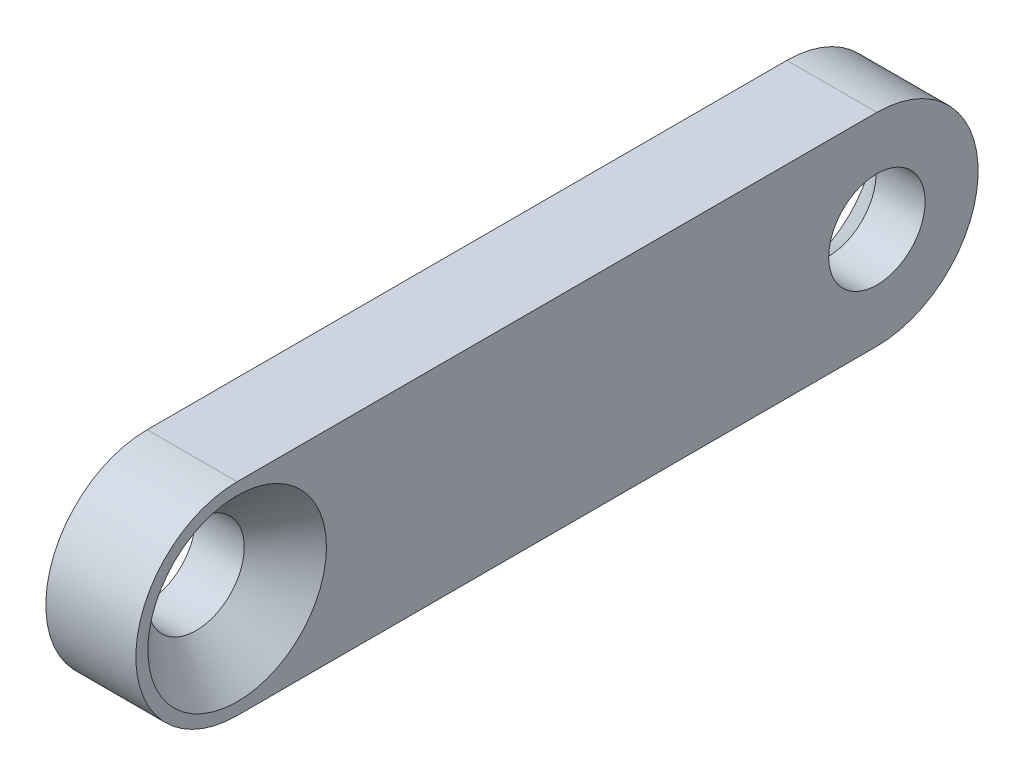
ISO-10303-21;
HEADER;
FILE_DESCRIPTION(('STEP AP214'),'2;1');
FILE_NAME('part.step','',(''),(''),'','','');
FILE_SCHEMA(('AUTOMOTIVE_DESIGN { 1 0 10303 214 1 1 1 1 }'));
ENDSEC;
DATA;
#1=APPLICATION_CONTEXT('core data for automotive mechanical design processes');
#2=APPLICATION_PROTOCOL_DEFINITION('international standard','automotive_design',2000,#1);
#3=PRODUCT_CONTEXT('',#1,'mechanical');
#4=PRODUCT('Part','Part','',(#3));
#5=PRODUCT_RELATED_PRODUCT_CATEGORY('part','',(#4));
#6=PRODUCT_DEFINITION_FORMATION('','',#4);
#7=PRODUCT_DEFINITION_CONTEXT('part definition',#1,'design');
#8=PRODUCT_DEFINITION('design','',#6,#7);
#9=PRODUCT_DEFINITION_SHAPE('','',#8);
#10=(LENGTH_UNIT() NAMED_UNIT(*) SI_UNIT(.MILLI.,.METRE.));
#11=(NAMED_UNIT(*) PLANE_ANGLE_UNIT() SI_UNIT($,.RADIAN.));
#12=(NAMED_UNIT(*) SI_UNIT($,.STERADIAN.) SOLID_ANGLE_UNIT());
#13=UNCERTAINTY_MEASURE_WITH_UNIT(LENGTH_MEASURE(1.E-05),#10,'distance_accuracy_value','');
#14=(GEOMETRIC_REPRESENTATION_CONTEXT(3) GLOBAL_UNCERTAINTY_ASSIGNED_CONTEXT((#13)) GLOBAL_UNIT_ASSIGNED_CONTEXT((#10,
#11,#12)) REPRESENTATION_CONTEXT('',''));
#15=CARTESIAN_POINT('',(0.,0.,0.));
#16=DIRECTION('',(0.,0.,1.));
#17=DIRECTION('',(1.,0.,0.));
#18=AXIS2_PLACEMENT_3D('',#15,#16,#17);
#19=CARTESIAN_POINT('',(3.175,0.,11.281730167));
#20=DIRECTION('',(-1.,0.,0.));
#21=DIRECTION('',(0.,0.,1.));
#22=AXIS2_PLACEMENT_3D('',#19,#20,#21);
#23=CYLINDRICAL_SURFACE('',#22,3.571875);
#24=CARTESIAN_POINT('',(0.,0.,11.281730167));
#25=DIRECTION('',(1.,0.,0.));
#26=DIRECTION('',(0.,0.,-1.));
#27=AXIS2_PLACEMENT_3D('',#24,#25,#26);
#28=CIRCLE('',#27,3.571875);
#29=CARTESIAN_POINT('',(0.,3.571875,11.281730167));
#30=VERTEX_POINT('',#29);
#31=CARTESIAN_POINT('',(0.,-3.571875,11.281730167));
#32=VERTEX_POINT('',#31);
#33=EDGE_CURVE('E101',#30,#32,#28,.T.);
#34=ORIENTED_EDGE('',*,*,#33,.T.);
#35=DIRECTION('',(-1.,0.,0.));
#36=VECTOR('',#35,1.);
#37=CARTESIAN_POINT('',(3.175,-3.571875,11.281730167));
#38=LINE('',#37,#36);
#39=CARTESIAN_POINT('',(3.175,-3.571875,11.281730167));
#40=VERTEX_POINT('',#39);
#41=EDGE_CURVE('E11',#40,#32,#38,.T.);
#42=ORIENTED_EDGE('',*,*,#41,.F.);
#43=CARTESIAN_POINT('',(3.175,0.,11.281730167));
#44=DIRECTION('',(1.,0.,0.));
#45=DIRECTION('',(0.,0.,-1.));
#46=AXIS2_PLACEMENT_3D('',#43,#44,#45);
#47=CIRCLE('',#46,3.571875);
#48=CARTESIAN_POINT('',(3.175,3.571875,11.281730167));
#49=VERTEX_POINT('',#48);
#50=EDGE_CURVE('E88',#49,#40,#47,.T.);
#51=ORIENTED_EDGE('',*,*,#50,.F.);
#52=DIRECTION('',(-1.,0.,0.));
#53=VECTOR('',#52,1.);
#54=CARTESIAN_POINT('',(3.175,3.571875,11.281730167));
#55=LINE('',#54,#53);
#56=EDGE_CURVE('E97',#49,#30,#55,.T.);
#57=ORIENTED_EDGE('',*,*,#56,.T.);
#58=EDGE_LOOP('',(#34,#42,#51,#57));
#59=FACE_BOUND('',#58,.T.);
#60=ADVANCED_FACE('F35',(#59),#23,.T.);
#61=CARTESIAN_POINT('',(3.175,-3.571875,11.281730167));
#62=DIRECTION('',(0.,1.,0.));
#63=DIRECTION('',(0.,0.,1.));
#64=AXIS2_PLACEMENT_3D('',#61,#62,#63);
#65=PLANE('',#64);
#66=DIRECTION('',(0.,0.,-1.));
#67=VECTOR('',#66,1.);
#68=CARTESIAN_POINT('',(0.,-3.571875,11.281730167));
#69=LINE('',#68,#67);
#70=CARTESIAN_POINT('',(0.,-3.571875,-11.281730167));
#71=VERTEX_POINT('',#70);
#72=EDGE_CURVE('E92',#32,#71,#69,.T.);
#73=ORIENTED_EDGE('',*,*,#72,.T.);
#74=DIRECTION('',(-1.,0.,0.));
#75=VECTOR('',#74,1.);
#76=CARTESIAN_POINT('',(3.175,-3.571875,-11.281730167));
#77=LINE('',#76,#75);
#78=CARTESIAN_POINT('',(3.175,-3.571875,-11.281730167));
#79=VERTEX_POINT('',#78);
#80=EDGE_CURVE('E44',#79,#71,#77,.T.);
#81=ORIENTED_EDGE('',*,*,#80,.F.);
#82=DIRECTION('',(0.,0.,-1.));
#83=VECTOR('',#82,1.);
#84=CARTESIAN_POINT('',(3.175,-3.571875,11.281730167));
#85=LINE('',#84,#83);
#86=EDGE_CURVE('E83',#40,#79,#85,.T.);
#87=ORIENTED_EDGE('',*,*,#86,.F.);
#88=ORIENTED_EDGE('',*,*,#41,.T.);
#89=EDGE_LOOP('',(#73,#81,#87,#88));
#90=FACE_BOUND('',#89,.T.);
#91=ADVANCED_FACE('F91',(#90),#65,.F.);
#92=CARTESIAN_POINT('',(3.175,0.,-11.281730167));
#93=DIRECTION('',(-1.,0.,0.));
#94=DIRECTION('',(0.,0.,1.));
#95=AXIS2_PLACEMENT_3D('',#92,#93,#94);
#96=CYLINDRICAL_SURFACE('',#95,3.571875);
#97=CARTESIAN_POINT('',(0.,0.,-11.281730167));
#98=DIRECTION('',(1.,0.,0.));
#99=DIRECTION('',(0.,0.,-1.));
#100=AXIS2_PLACEMENT_3D('',#97,#98,#99);
#101=CIRCLE('',#100,3.571875);
#102=CARTESIAN_POINT('',(0.,3.571875,-11.281730167));
#103=VERTEX_POINT('',#102);
#104=EDGE_CURVE('E70',#71,#103,#101,.T.);
#105=ORIENTED_EDGE('',*,*,#104,.T.);
#106=DIRECTION('',(-1.,0.,0.));
#107=VECTOR('',#106,1.);
#108=CARTESIAN_POINT('',(3.175,3.571875,-11.281730167));
#109=LINE('',#108,#107);
#110=CARTESIAN_POINT('',(3.175,3.571875,-11.281730167));
#111=VERTEX_POINT('',#110);
#112=EDGE_CURVE('E93',#111,#103,#109,.T.);
#113=ORIENTED_EDGE('',*,*,#112,.F.);
#114=CARTESIAN_POINT('',(3.175,0.,-11.281730167));
#115=DIRECTION('',(1.,0.,0.));
#116=DIRECTION('',(0.,0.,-1.));
#117=AXIS2_PLACEMENT_3D('',#114,#115,#116);
#118=CIRCLE('',#117,3.571875);
#119=EDGE_CURVE('E86',#79,#111,#118,.T.);
#120=ORIENTED_EDGE('',*,*,#119,.F.);
#121=ORIENTED_EDGE('',*,*,#80,.T.);
#122=EDGE_LOOP('',(#105,#113,#120,#121));
#123=FACE_BOUND('',#122,.T.);
#124=ADVANCED_FACE('F95',(#123),#96,.T.);
#125=CARTESIAN_POINT('',(3.175,3.571875,11.281730167));
#126=DIRECTION('',(0.,-1.,0.));
#127=DIRECTION('',(0.,0.,-1.));
#128=AXIS2_PLACEMENT_3D('',#125,#126,#127);
#129=PLANE('',#128);
#130=DIRECTION('',(0.,0.,1.));
#131=VECTOR('',#130,1.);
#132=CARTESIAN_POINT('',(0.,3.571875,11.281730167));
#133=LINE('',#132,#131);
#134=EDGE_CURVE('E76',#103,#30,#133,.T.);
#135=ORIENTED_EDGE('',*,*,#134,.T.);
#136=ORIENTED_EDGE('',*,*,#56,.F.);
#137=DIRECTION('',(0.,0.,1.));
#138=VECTOR('',#137,1.);
#139=CARTESIAN_POINT('',(3.175,3.571875,11.281730167));
#140=LINE('',#139,#138);
#141=EDGE_CURVE('E53',#111,#49,#140,.T.);
#142=ORIENTED_EDGE('',*,*,#141,.F.);
#143=ORIENTED_EDGE('',*,*,#112,.T.);
#144=EDGE_LOOP('',(#135,#136,#142,#143));
#145=FACE_BOUND('',#144,.T.);
#146=ADVANCED_FACE('F133',(#145),#129,.F.);
#147=CARTESIAN_POINT('',(3.175,0.,11.281730167));
#148=DIRECTION('',(1.,0.,0.));
#149=DIRECTION('',(0.,0.,-1.));
#150=AXIS2_PLACEMENT_3D('',#147,#148,#149);
#151=PLANE('',#150);
#152=CARTESIAN_POINT('',(3.175,0.,11.281730167));
#153=DIRECTION('',(1.,0.,0.));
#154=DIRECTION('',(0.,0.,-1.));
#155=AXIS2_PLACEMENT_3D('',#152,#153,#154);
#156=CIRCLE('',#155,3.15);
#157=CARTESIAN_POINT('',(3.175,0.,8.131730167));
#158=VERTEX_POINT('',#157);
#159=EDGE_CURVE('E124',#158,#158,#156,.T.);
#160=ORIENTED_EDGE('',*,*,#159,.F.);
#161=EDGE_LOOP('',(#160));
#162=FACE_BOUND('',#161,.T.);
#163=CARTESIAN_POINT('',(3.175,0.,-11.281730167));
#164=DIRECTION('',(1.,0.,0.));
#165=DIRECTION('',(0.,0.,-1.));
#166=AXIS2_PLACEMENT_3D('',#163,#164,#165);
#167=CIRCLE('',#166,1.7);
#168=CARTESIAN_POINT('',(3.175,0.,-12.981730167));
#169=VERTEX_POINT('',#168);
#170=EDGE_CURVE('E104',#169,#169,#167,.T.);
#171=ORIENTED_EDGE('',*,*,#170,.F.);
#172=EDGE_LOOP('',(#171));
#173=FACE_BOUND('',#172,.T.);
#174=ORIENTED_EDGE('',*,*,#50,.T.);
#175=ORIENTED_EDGE('',*,*,#86,.T.);
#176=ORIENTED_EDGE('',*,*,#119,.T.);
#177=ORIENTED_EDGE('',*,*,#141,.T.);
#178=EDGE_LOOP('',(#174,#175,#176,#177));
#179=FACE_BOUND('',#178,.T.);
#180=ADVANCED_FACE('F84',(#162,#173,#179),#151,.T.);
#181=CARTESIAN_POINT('',(0.,0.,11.281730167));
#182=DIRECTION('',(1.,0.,0.));
#183=DIRECTION('',(0.,0.,-1.));
#184=AXIS2_PLACEMENT_3D('',#181,#182,#183);
#185=PLANE('',#184);
#186=CARTESIAN_POINT('',(0.,0.,11.281730167));
#187=DIRECTION('',(1.,0.,0.));
#188=DIRECTION('',(0.,0.,-1.));
#189=AXIS2_PLACEMENT_3D('',#186,#187,#188);
#190=CIRCLE('',#189,1.69999999999999);
#191=CARTESIAN_POINT('',(0.,0.,9.58173016700001));
#192=VERTEX_POINT('',#191);
#193=EDGE_CURVE('E38',#192,#192,#190,.T.);
#194=ORIENTED_EDGE('',*,*,#193,.T.);
#195=EDGE_LOOP('',(#194));
#196=FACE_BOUND('',#195,.T.);
#197=CARTESIAN_POINT('',(0.,0.,-11.281730167));
#198=DIRECTION('',(-1.,0.,0.));
#199=DIRECTION('',(0.,0.,1.));
#200=AXIS2_PLACEMENT_3D('',#197,#198,#199);
#201=CIRCLE('',#200,3.15);
#202=CARTESIAN_POINT('',(0.,0.,-8.131730167));
#203=VERTEX_POINT('',#202);
#204=EDGE_CURVE('E114',#203,#203,#201,.T.);
#205=ORIENTED_EDGE('',*,*,#204,.F.);
#206=EDGE_LOOP('',(#205));
#207=FACE_BOUND('',#206,.T.);
#208=ORIENTED_EDGE('',*,*,#33,.F.);
#209=ORIENTED_EDGE('',*,*,#134,.F.);
#210=ORIENTED_EDGE('',*,*,#104,.F.);
#211=ORIENTED_EDGE('',*,*,#72,.F.);
#212=EDGE_LOOP('',(#208,#209,#210,#211));
#213=FACE_BOUND('',#212,.T.);
#214=ADVANCED_FACE('F132',(#196,#207,#213),#185,.F.);
#215=CARTESIAN_POINT('',(0.,0.,-11.281730167));
#216=DIRECTION('',(-1.,0.,0.));
#217=DIRECTION('',(0.,0.,1.));
#218=AXIS2_PLACEMENT_3D('',#215,#216,#217);
#219=CYLINDRICAL_SURFACE('',#218,1.7);
#220=ORIENTED_EDGE('',*,*,#170,.T.);
#221=EDGE_LOOP('',(#220));
#222=FACE_BOUND('',#221,.T.);
#223=CARTESIAN_POINT('',(1.45,0.,-11.281730167));
#224=DIRECTION('',(-1.,0.,0.));
#225=DIRECTION('',(0.,0.,1.));
#226=AXIS2_PLACEMENT_3D('',#223,#224,#225);
#227=CIRCLE('',#226,1.7);
#228=CARTESIAN_POINT('',(1.45,0.,-9.581730167));
#229=VERTEX_POINT('',#228);
#230=EDGE_CURVE('E110',#229,#229,#227,.T.);
#231=ORIENTED_EDGE('',*,*,#230,.T.);
#232=EDGE_LOOP('',(#231));
#233=FACE_BOUND('',#232,.T.);
#234=ADVANCED_FACE('F139',(#222,#233),#219,.F.);
#235=CARTESIAN_POINT('',(0.,0.,-11.281730167));
#236=DIRECTION('',(-1.,0.,0.));
#237=DIRECTION('',(0.,0.,1.));
#238=AXIS2_PLACEMENT_3D('',#235,#236,#237);
#239=CONICAL_SURFACE('',#238,3.15,0.785398163397449);
#240=ORIENTED_EDGE('',*,*,#230,.F.);
#241=EDGE_LOOP('',(#240));
#242=FACE_BOUND('',#241,.T.);
#243=ORIENTED_EDGE('',*,*,#204,.T.);
#244=EDGE_LOOP('',(#243));
#245=FACE_BOUND('',#244,.T.);
#246=ADVANCED_FACE('F171',(#242,#245),#239,.F.);
#247=CARTESIAN_POINT('',(3.175,0.,11.281730167));
#248=DIRECTION('',(1.,0.,0.));
#249=DIRECTION('',(0.,0.,-1.));
#250=AXIS2_PLACEMENT_3D('',#247,#248,#249);
#251=CYLINDRICAL_SURFACE('',#250,1.69999999999999);
#252=CARTESIAN_POINT('',(1.72499999999999,0.,11.281730167));
#253=DIRECTION('',(1.,0.,0.));
#254=DIRECTION('',(0.,0.,-1.));
#255=AXIS2_PLACEMENT_3D('',#252,#253,#254);
#256=CIRCLE('',#255,1.69999999999999);
#257=CARTESIAN_POINT('',(1.72499999999999,0.,9.58173016700001));
#258=VERTEX_POINT('',#257);
#259=EDGE_CURVE('E121',#258,#258,#256,.T.);
#260=ORIENTED_EDGE('',*,*,#259,.T.);
#261=EDGE_LOOP('',(#260));
#262=FACE_BOUND('',#261,.T.);
#263=ORIENTED_EDGE('',*,*,#193,.F.);
#264=EDGE_LOOP('',(#263));
#265=FACE_BOUND('',#264,.T.);
#266=ADVANCED_FACE('F179',(#262,#265),#251,.F.);
#267=CARTESIAN_POINT('',(3.175,0.,11.281730167));
#268=DIRECTION('',(1.,0.,0.));
#269=DIRECTION('',(0.,0.,-1.));
#270=AXIS2_PLACEMENT_3D('',#267,#268,#269);
#271=CONICAL_SURFACE('',#270,3.15,0.78539816339745);
#272=ORIENTED_EDGE('',*,*,#259,.F.);
#273=EDGE_LOOP('',(#272));
#274=FACE_BOUND('',#273,.T.);
#275=ORIENTED_EDGE('',*,*,#159,.T.);
#276=EDGE_LOOP('',(#275));
#277=FACE_BOUND('',#276,.T.);
#278=ADVANCED_FACE('F128',(#274,#277),#271,.F.);
#279=CLOSED_SHELL('',(#60,#91,#124,#146,#180,#214,#234,#246,#266,#278));
#280=MANIFOLD_SOLID_BREP('B2',#279);
#281=ADVANCED_BREP_SHAPE_REPRESENTATION('',(#18,#280),#14);
#282=SHAPE_DEFINITION_REPRESENTATION(#9,#281);
ENDSEC;
END-ISO-10303-21;
